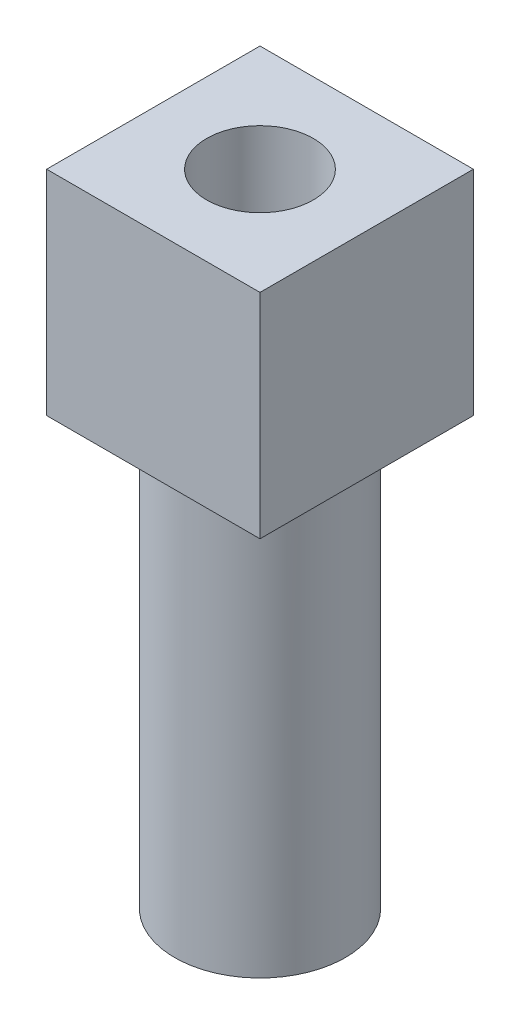
ISO-10303-21;
HEADER;
FILE_DESCRIPTION(('STEP AP214'),'2;1');
FILE_NAME('part.step','',(''),(''),'','','');
FILE_SCHEMA(('AUTOMOTIVE_DESIGN { 1 0 10303 214 1 1 1 1 }'));
ENDSEC;
DATA;
#1=APPLICATION_CONTEXT('core data for automotive mechanical design processes');
#2=APPLICATION_PROTOCOL_DEFINITION('international standard','automotive_design',2000,#1);
#3=PRODUCT_CONTEXT('',#1,'mechanical');
#4=PRODUCT('Part','Part','',(#3));
#5=PRODUCT_RELATED_PRODUCT_CATEGORY('part','',(#4));
#6=PRODUCT_DEFINITION_FORMATION('','',#4);
#7=PRODUCT_DEFINITION_CONTEXT('part definition',#1,'design');
#8=PRODUCT_DEFINITION('design','',#6,#7);
#9=PRODUCT_DEFINITION_SHAPE('','',#8);
#10=(LENGTH_UNIT() NAMED_UNIT(*) SI_UNIT(.MILLI.,.METRE.));
#11=(NAMED_UNIT(*) PLANE_ANGLE_UNIT() SI_UNIT($,.RADIAN.));
#12=(NAMED_UNIT(*) SI_UNIT($,.STERADIAN.) SOLID_ANGLE_UNIT());
#13=UNCERTAINTY_MEASURE_WITH_UNIT(LENGTH_MEASURE(1.E-05),#10,'distance_accuracy_value','');
#14=(GEOMETRIC_REPRESENTATION_CONTEXT(3) GLOBAL_UNCERTAINTY_ASSIGNED_CONTEXT((#13)) GLOBAL_UNIT_ASSIGNED_CONTEXT((#10,
#11,#12)) REPRESENTATION_CONTEXT('',''));
#15=CARTESIAN_POINT('',(0.,0.,0.));
#16=DIRECTION('',(0.,0.,1.));
#17=DIRECTION('',(1.,0.,0.));
#18=AXIS2_PLACEMENT_3D('',#15,#16,#17);
#19=CARTESIAN_POINT('',(0.,0.,0.));
#20=DIRECTION('',(0.,-1.,0.));
#21=DIRECTION('',(0.,0.,-1.));
#22=AXIS2_PLACEMENT_3D('',#19,#20,#21);
#23=PLANE('',#22);
#24=CARTESIAN_POINT('',(0.,0.,0.));
#25=DIRECTION('',(0.,1.,0.));
#26=DIRECTION('',(0.,0.,1.));
#27=AXIS2_PLACEMENT_3D('',#24,#25,#26);
#28=CIRCLE('',#27,2.5);
#29=CARTESIAN_POINT('',(0.,0.,2.5));
#30=VERTEX_POINT('',#29);
#31=EDGE_CURVE('E115',#30,#30,#28,.T.);
#32=ORIENTED_EDGE('',*,*,#31,.T.);
#33=EDGE_LOOP('',(#32));
#34=FACE_BOUND('',#33,.T.);
#35=CARTESIAN_POINT('',(0.,0.,0.));
#36=DIRECTION('',(0.,-1.,0.));
#37=DIRECTION('',(0.,0.,-1.));
#38=AXIS2_PLACEMENT_3D('',#35,#36,#37);
#39=CIRCLE('',#38,4.);
#40=CARTESIAN_POINT('',(0.,0.,-4.));
#41=VERTEX_POINT('',#40);
#42=EDGE_CURVE('E11',#41,#41,#39,.T.);
#43=ORIENTED_EDGE('',*,*,#42,.T.);
#44=EDGE_LOOP('',(#43));
#45=FACE_BOUND('',#44,.T.);
#46=ADVANCED_FACE('F39',(#34,#45),#23,.T.);
#47=CARTESIAN_POINT('',(0.,-2.45930268585907,0.));
#48=DIRECTION('',(0.,-1.,0.));
#49=DIRECTION('',(0.,0.,-1.));
#50=AXIS2_PLACEMENT_3D('',#47,#48,#49);
#51=CYLINDRICAL_SURFACE('',#50,4.);
#52=CARTESIAN_POINT('',(0.,20.,0.));
#53=DIRECTION('',(0.,1.,0.));
#54=DIRECTION('',(0.,0.,1.));
#55=AXIS2_PLACEMENT_3D('',#52,#53,#54);
#56=CIRCLE('',#55,4.);
#57=CARTESIAN_POINT('',(0.,20.,4.));
#58=VERTEX_POINT('',#57);
#59=EDGE_CURVE('E48',#58,#58,#56,.F.);
#60=ORIENTED_EDGE('',*,*,#59,.T.);
#61=EDGE_LOOP('',(#60));
#62=FACE_BOUND('',#61,.T.);
#63=ORIENTED_EDGE('',*,*,#42,.F.);
#64=EDGE_LOOP('',(#63));
#65=FACE_BOUND('',#64,.T.);
#66=ADVANCED_FACE('F131',(#62,#65),#51,.T.);
#67=CARTESIAN_POINT('',(-5.,30.,-5.));
#68=DIRECTION('',(1.,0.,0.));
#69=DIRECTION('',(0.,0.,-1.));
#70=AXIS2_PLACEMENT_3D('',#67,#68,#69);
#71=PLANE('',#70);
#72=DIRECTION('',(0.,0.,1.));
#73=VECTOR('',#72,1.);
#74=CARTESIAN_POINT('',(-5.,20.,-5.));
#75=LINE('',#74,#73);
#76=CARTESIAN_POINT('',(-5.,20.,-5.));
#77=VERTEX_POINT('',#76);
#78=CARTESIAN_POINT('',(-5.,20.,5.));
#79=VERTEX_POINT('',#78);
#80=EDGE_CURVE('E111',#77,#79,#75,.T.);
#81=ORIENTED_EDGE('',*,*,#80,.T.);
#82=DIRECTION('',(0.,-1.,0.));
#83=VECTOR('',#82,1.);
#84=CARTESIAN_POINT('',(-5.,30.,5.));
#85=LINE('',#84,#83);
#86=CARTESIAN_POINT('',(-5.,30.,5.));
#87=VERTEX_POINT('',#86);
#88=EDGE_CURVE('E100',#87,#79,#85,.T.);
#89=ORIENTED_EDGE('',*,*,#88,.F.);
#90=DIRECTION('',(0.,0.,1.));
#91=VECTOR('',#90,1.);
#92=CARTESIAN_POINT('',(-5.,30.,-5.));
#93=LINE('',#92,#91);
#94=CARTESIAN_POINT('',(-5.,30.,-5.));
#95=VERTEX_POINT('',#94);
#96=EDGE_CURVE('E92',#95,#87,#93,.T.);
#97=ORIENTED_EDGE('',*,*,#96,.F.);
#98=DIRECTION('',(0.,-1.,0.));
#99=VECTOR('',#98,1.);
#100=CARTESIAN_POINT('',(-5.,30.,-5.));
#101=LINE('',#100,#99);
#102=EDGE_CURVE('E107',#95,#77,#101,.T.);
#103=ORIENTED_EDGE('',*,*,#102,.T.);
#104=EDGE_LOOP('',(#81,#89,#97,#103));
#105=FACE_BOUND('',#104,.T.);
#106=ADVANCED_FACE('F141',(#105),#71,.F.);
#107=CARTESIAN_POINT('',(-5.,30.,5.));
#108=DIRECTION('',(0.,0.,-1.));
#109=DIRECTION('',(-1.,0.,0.));
#110=AXIS2_PLACEMENT_3D('',#107,#108,#109);
#111=PLANE('',#110);
#112=DIRECTION('',(1.,0.,0.));
#113=VECTOR('',#112,1.);
#114=CARTESIAN_POINT('',(-5.,20.,5.));
#115=LINE('',#114,#113);
#116=CARTESIAN_POINT('',(5.,20.,5.));
#117=VERTEX_POINT('',#116);
#118=EDGE_CURVE('E98',#79,#117,#115,.T.);
#119=ORIENTED_EDGE('',*,*,#118,.T.);
#120=DIRECTION('',(0.,-1.,0.));
#121=VECTOR('',#120,1.);
#122=CARTESIAN_POINT('',(5.,30.,5.));
#123=LINE('',#122,#121);
#124=CARTESIAN_POINT('',(5.,30.,5.));
#125=VERTEX_POINT('',#124);
#126=EDGE_CURVE('E96',#125,#117,#123,.T.);
#127=ORIENTED_EDGE('',*,*,#126,.F.);
#128=DIRECTION('',(1.,0.,0.));
#129=VECTOR('',#128,1.);
#130=CARTESIAN_POINT('',(-5.,30.,5.));
#131=LINE('',#130,#129);
#132=EDGE_CURVE('E87',#87,#125,#131,.T.);
#133=ORIENTED_EDGE('',*,*,#132,.F.);
#134=ORIENTED_EDGE('',*,*,#88,.T.);
#135=EDGE_LOOP('',(#119,#127,#133,#134));
#136=FACE_BOUND('',#135,.T.);
#137=ADVANCED_FACE('F97',(#136),#111,.F.);
#138=CARTESIAN_POINT('',(5.,30.,-5.));
#139=DIRECTION('',(-1.,0.,0.));
#140=DIRECTION('',(0.,0.,1.));
#141=AXIS2_PLACEMENT_3D('',#138,#139,#140);
#142=PLANE('',#141);
#143=DIRECTION('',(0.,0.,-1.));
#144=VECTOR('',#143,1.);
#145=CARTESIAN_POINT('',(5.,20.,-5.));
#146=LINE('',#145,#144);
#147=CARTESIAN_POINT('',(5.,20.,-5.));
#148=VERTEX_POINT('',#147);
#149=EDGE_CURVE('E73',#117,#148,#146,.T.);
#150=ORIENTED_EDGE('',*,*,#149,.T.);
#151=DIRECTION('',(0.,-1.,0.));
#152=VECTOR('',#151,1.);
#153=CARTESIAN_POINT('',(5.,30.,-5.));
#154=LINE('',#153,#152);
#155=CARTESIAN_POINT('',(5.,30.,-5.));
#156=VERTEX_POINT('',#155);
#157=EDGE_CURVE('E101',#156,#148,#154,.T.);
#158=ORIENTED_EDGE('',*,*,#157,.F.);
#159=DIRECTION('',(0.,0.,-1.));
#160=VECTOR('',#159,1.);
#161=CARTESIAN_POINT('',(5.,30.,-5.));
#162=LINE('',#161,#160);
#163=EDGE_CURVE('E90',#125,#156,#162,.T.);
#164=ORIENTED_EDGE('',*,*,#163,.F.);
#165=ORIENTED_EDGE('',*,*,#126,.T.);
#166=EDGE_LOOP('',(#150,#158,#164,#165));
#167=FACE_BOUND('',#166,.T.);
#168=ADVANCED_FACE('F103',(#167),#142,.F.);
#169=CARTESIAN_POINT('',(-5.,30.,-5.));
#170=DIRECTION('',(0.,0.,1.));
#171=DIRECTION('',(1.,0.,0.));
#172=AXIS2_PLACEMENT_3D('',#169,#170,#171);
#173=PLANE('',#172);
#174=DIRECTION('',(-1.,0.,0.));
#175=VECTOR('',#174,1.);
#176=CARTESIAN_POINT('',(-5.,20.,-5.));
#177=LINE('',#176,#175);
#178=EDGE_CURVE('E79',#148,#77,#177,.T.);
#179=ORIENTED_EDGE('',*,*,#178,.T.);
#180=ORIENTED_EDGE('',*,*,#102,.F.);
#181=DIRECTION('',(-1.,0.,0.));
#182=VECTOR('',#181,1.);
#183=CARTESIAN_POINT('',(-5.,30.,-5.));
#184=LINE('',#183,#182);
#185=EDGE_CURVE('E56',#156,#95,#184,.T.);
#186=ORIENTED_EDGE('',*,*,#185,.F.);
#187=ORIENTED_EDGE('',*,*,#157,.T.);
#188=EDGE_LOOP('',(#179,#180,#186,#187));
#189=FACE_BOUND('',#188,.T.);
#190=ADVANCED_FACE('F142',(#189),#173,.F.);
#191=CARTESIAN_POINT('',(0.,30.,0.));
#192=DIRECTION('',(0.,1.,0.));
#193=DIRECTION('',(0.,0.,1.));
#194=AXIS2_PLACEMENT_3D('',#191,#192,#193);
#195=PLANE('',#194);
#196=CARTESIAN_POINT('',(0.,30.,0.));
#197=DIRECTION('',(0.,1.,0.));
#198=DIRECTION('',(0.,0.,1.));
#199=AXIS2_PLACEMENT_3D('',#196,#197,#198);
#200=CIRCLE('',#199,2.5);
#201=CARTESIAN_POINT('',(0.,30.,2.5));
#202=VERTEX_POINT('',#201);
#203=EDGE_CURVE('E163',#202,#202,#200,.T.);
#204=ORIENTED_EDGE('',*,*,#203,.F.);
#205=EDGE_LOOP('',(#204));
#206=FACE_BOUND('',#205,.T.);
#207=ORIENTED_EDGE('',*,*,#96,.T.);
#208=ORIENTED_EDGE('',*,*,#132,.T.);
#209=ORIENTED_EDGE('',*,*,#163,.T.);
#210=ORIENTED_EDGE('',*,*,#185,.T.);
#211=EDGE_LOOP('',(#207,#208,#209,#210));
#212=FACE_BOUND('',#211,.T.);
#213=ADVANCED_FACE('F88',(#206,#212),#195,.T.);
#214=CARTESIAN_POINT('',(0.,20.,0.));
#215=DIRECTION('',(0.,1.,0.));
#216=DIRECTION('',(0.,0.,1.));
#217=AXIS2_PLACEMENT_3D('',#214,#215,#216);
#218=PLANE('',#217);
#219=ORIENTED_EDGE('',*,*,#59,.F.);
#220=EDGE_LOOP('',(#219));
#221=FACE_BOUND('',#220,.T.);
#222=ORIENTED_EDGE('',*,*,#80,.F.);
#223=ORIENTED_EDGE('',*,*,#178,.F.);
#224=ORIENTED_EDGE('',*,*,#149,.F.);
#225=ORIENTED_EDGE('',*,*,#118,.F.);
#226=EDGE_LOOP('',(#222,#223,#224,#225));
#227=FACE_BOUND('',#226,.T.);
#228=ADVANCED_FACE('F134',(#221,#227),#218,.F.);
#229=CARTESIAN_POINT('',(0.,0.,0.));
#230=DIRECTION('',(0.,1.,0.));
#231=DIRECTION('',(0.,0.,1.));
#232=AXIS2_PLACEMENT_3D('',#229,#230,#231);
#233=CYLINDRICAL_SURFACE('',#232,2.5);
#234=ORIENTED_EDGE('',*,*,#31,.F.);
#235=EDGE_LOOP('',(#234));
#236=FACE_BOUND('',#235,.T.);
#237=ORIENTED_EDGE('',*,*,#203,.T.);
#238=EDGE_LOOP('',(#237));
#239=FACE_BOUND('',#238,.T.);
#240=ADVANCED_FACE('F137',(#236,#239),#233,.F.);
#241=CLOSED_SHELL('',(#46,#66,#106,#137,#168,#190,#213,#228,#240));
#242=MANIFOLD_SOLID_BREP('B2',#241);
#243=ADVANCED_BREP_SHAPE_REPRESENTATION('',(#18,#242),#14);
#244=SHAPE_DEFINITION_REPRESENTATION(#9,#243);
ENDSEC;
END-ISO-10303-21;
